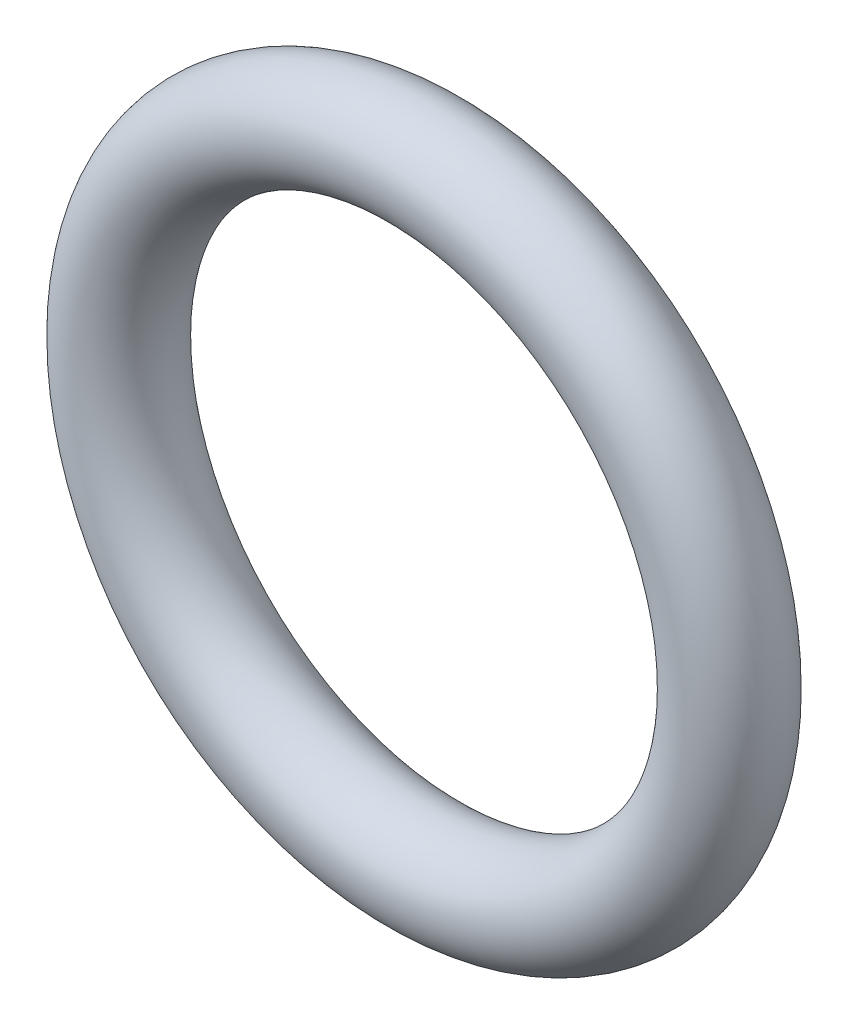
ISO-10303-21;
HEADER;
FILE_DESCRIPTION(('STEP AP214'),'2;1');
FILE_NAME('part.step','',(''),(''),'','','');
FILE_SCHEMA(('AUTOMOTIVE_DESIGN { 1 0 10303 214 1 1 1 1 }'));
ENDSEC;
DATA;
#1=APPLICATION_CONTEXT('core data for automotive mechanical design processes');
#2=APPLICATION_PROTOCOL_DEFINITION('international standard','automotive_design',2000,#1);
#3=PRODUCT_CONTEXT('',#1,'mechanical');
#4=PRODUCT('Part','Part','',(#3));
#5=PRODUCT_RELATED_PRODUCT_CATEGORY('part','',(#4));
#6=PRODUCT_DEFINITION_FORMATION('','',#4);
#7=PRODUCT_DEFINITION_CONTEXT('part definition',#1,'design');
#8=PRODUCT_DEFINITION('design','',#6,#7);
#9=PRODUCT_DEFINITION_SHAPE('','',#8);
#10=(LENGTH_UNIT() NAMED_UNIT(*) SI_UNIT(.MILLI.,.METRE.));
#11=(NAMED_UNIT(*) PLANE_ANGLE_UNIT() SI_UNIT($,.RADIAN.));
#12=(NAMED_UNIT(*) SI_UNIT($,.STERADIAN.) SOLID_ANGLE_UNIT());
#13=UNCERTAINTY_MEASURE_WITH_UNIT(LENGTH_MEASURE(1.E-05),#10,'distance_accuracy_value','');
#14=(GEOMETRIC_REPRESENTATION_CONTEXT(3) GLOBAL_UNCERTAINTY_ASSIGNED_CONTEXT((#13)) GLOBAL_UNIT_ASSIGNED_CONTEXT((#10,
#11,#12)) REPRESENTATION_CONTEXT('',''));
#15=CARTESIAN_POINT('',(0.,0.,0.));
#16=DIRECTION('',(0.,0.,1.));
#17=DIRECTION('',(1.,0.,0.));
#18=AXIS2_PLACEMENT_3D('',#15,#16,#17);
#19=CARTESIAN_POINT('',(0.,0.,0.));
#20=DIRECTION('',(0.,0.,1.));
#21=DIRECTION('',(1.,0.,0.));
#22=AXIS2_PLACEMENT_3D('',#19,#20,#21);
#23=TOROIDAL_SURFACE('',#22,6.,1.);
#24=CARTESIAN_POINT('',(6.,0.,0.));
#25=DIRECTION('',(0.,1.,0.));
#26=DIRECTION('',(-1.,0.,0.));
#27=AXIS2_PLACEMENT_3D('',#24,#25,#26);
#28=CIRCLE('',#27,1.);
#29=CARTESIAN_POINT('',(7.,0.,0.));
#30=VERTEX_POINT('',#29);
#31=EDGE_CURVE('E11',#30,#30,#28,.T.);
#32=CARTESIAN_POINT('',(0.,0.,0.));
#33=DIRECTION('',(0.,0.,1.));
#34=DIRECTION('',(1.,0.,0.));
#35=AXIS2_PLACEMENT_3D('',#32,#33,#34);
#36=CIRCLE('',#35,7.);
#37=EDGE_CURVE('',#30,#30,#36,.T.);
#38=ORIENTED_EDGE('',*,*,#31,.T.);
#39=ORIENTED_EDGE('',*,*,#31,.F.);
#40=ORIENTED_EDGE('',*,*,#37,.T.);
#41=ORIENTED_EDGE('',*,*,#37,.F.);
#42=EDGE_LOOP('',(#38,#40,#39,#41));
#43=FACE_BOUND('',#42,.T.);
#44=ADVANCED_FACE('F51',(#43),#23,.T.);
#45=CLOSED_SHELL('',(#44));
#46=MANIFOLD_SOLID_BREP('B2',#45);
#47=ADVANCED_BREP_SHAPE_REPRESENTATION('',(#18,#46),#14);
#48=SHAPE_DEFINITION_REPRESENTATION(#9,#47);
ENDSEC;
END-ISO-10303-21;
